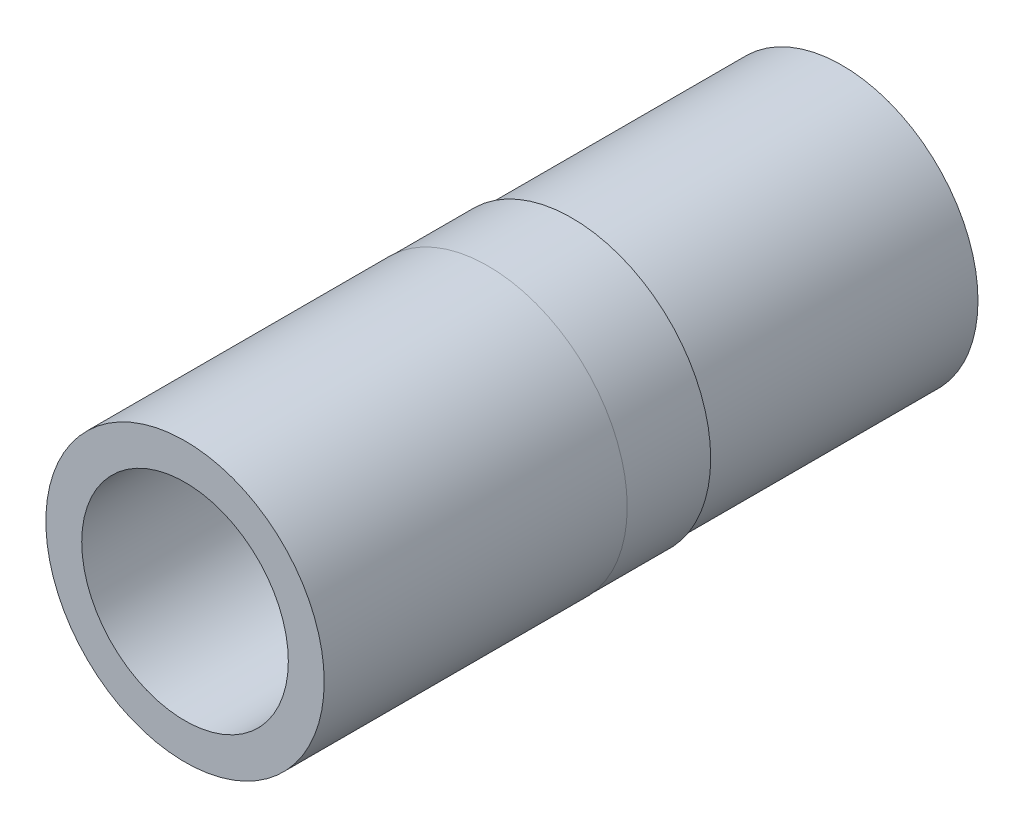
ISO-10303-21;
HEADER;
FILE_DESCRIPTION(('STEP AP214'),'2;1');
FILE_NAME('part.step','',(''),(''),'','','');
FILE_SCHEMA(('AUTOMOTIVE_DESIGN { 1 0 10303 214 1 1 1 1 }'));
ENDSEC;
DATA;
#1=APPLICATION_CONTEXT('core data for automotive mechanical design processes');
#2=APPLICATION_PROTOCOL_DEFINITION('international standard','automotive_design',2000,#1);
#3=PRODUCT_CONTEXT('',#1,'mechanical');
#4=PRODUCT('Part','Part','',(#3));
#5=PRODUCT_RELATED_PRODUCT_CATEGORY('part','',(#4));
#6=PRODUCT_DEFINITION_FORMATION('','',#4);
#7=PRODUCT_DEFINITION_CONTEXT('part definition',#1,'design');
#8=PRODUCT_DEFINITION('design','',#6,#7);
#9=PRODUCT_DEFINITION_SHAPE('','',#8);
#10=(LENGTH_UNIT() NAMED_UNIT(*) SI_UNIT(.MILLI.,.METRE.));
#11=(NAMED_UNIT(*) PLANE_ANGLE_UNIT() SI_UNIT($,.RADIAN.));
#12=(NAMED_UNIT(*) SI_UNIT($,.STERADIAN.) SOLID_ANGLE_UNIT());
#13=UNCERTAINTY_MEASURE_WITH_UNIT(LENGTH_MEASURE(1.E-05),#10,'distance_accuracy_value','');
#14=(GEOMETRIC_REPRESENTATION_CONTEXT(3) GLOBAL_UNCERTAINTY_ASSIGNED_CONTEXT((#13)) GLOBAL_UNIT_ASSIGNED_CONTEXT((#10,
#11,#12)) REPRESENTATION_CONTEXT('',''));
#15=CARTESIAN_POINT('',(0.,0.,0.));
#16=DIRECTION('',(0.,0.,1.));
#17=DIRECTION('',(1.,0.,0.));
#18=AXIS2_PLACEMENT_3D('',#15,#16,#17);
#19=CARTESIAN_POINT('',(0.,0.,67.2));
#20=DIRECTION('',(0.,0.,-1.));
#21=DIRECTION('',(-1.,0.,0.));
#22=AXIS2_PLACEMENT_3D('',#19,#20,#21);
#23=CYLINDRICAL_SURFACE('',#22,25.795);
#24=CARTESIAN_POINT('',(0.,0.,0.));
#25=DIRECTION('',(0.,0.,1.));
#26=DIRECTION('',(1.,0.,0.));
#27=AXIS2_PLACEMENT_3D('',#24,#25,#26);
#28=CIRCLE('',#27,25.795);
#29=CARTESIAN_POINT('',(25.795,0.,0.));
#30=VERTEX_POINT('',#29);
#31=EDGE_CURVE('E50',#30,#30,#28,.T.);
#32=ORIENTED_EDGE('',*,*,#31,.T.);
#33=EDGE_LOOP('',(#32));
#34=FACE_BOUND('',#33,.T.);
#35=CARTESIAN_POINT('',(0.,0.,51.3));
#36=DIRECTION('',(0.,0.,1.));
#37=DIRECTION('',(1.,0.,0.));
#38=AXIS2_PLACEMENT_3D('',#35,#36,#37);
#39=CIRCLE('',#38,25.795);
#40=CARTESIAN_POINT('',(25.795,0.,51.3));
#41=VERTEX_POINT('',#40);
#42=EDGE_CURVE('E10',#41,#41,#39,.T.);
#43=ORIENTED_EDGE('',*,*,#42,.F.);
#44=EDGE_LOOP('',(#43));
#45=FACE_BOUND('',#44,.T.);
#46=ADVANCED_FACE('F39',(#34,#45),#23,.T.);
#47=CARTESIAN_POINT('',(0.,0.,67.2));
#48=DIRECTION('',(0.,0.,-1.));
#49=DIRECTION('',(-1.,0.,0.));
#50=AXIS2_PLACEMENT_3D('',#47,#48,#49);
#51=CYLINDRICAL_SURFACE('',#50,21.195);
#52=CARTESIAN_POINT('',(0.,0.,10.73));
#53=DIRECTION('',(0.,0.,-1.));
#54=DIRECTION('',(-1.,0.,0.));
#55=AXIS2_PLACEMENT_3D('',#52,#53,#54);
#56=CIRCLE('',#55,21.195);
#57=CARTESIAN_POINT('',(-21.195,0.,10.73));
#58=VERTEX_POINT('',#57);
#59=EDGE_CURVE('E55',#58,#58,#56,.T.);
#60=ORIENTED_EDGE('',*,*,#59,.T.);
#61=EDGE_LOOP('',(#60));
#62=FACE_BOUND('',#61,.T.);
#63=CARTESIAN_POINT('',(0.,0.,51.3));
#64=DIRECTION('',(0.,0.,1.));
#65=DIRECTION('',(1.,0.,0.));
#66=AXIS2_PLACEMENT_3D('',#63,#64,#65);
#67=CIRCLE('',#66,21.195);
#68=CARTESIAN_POINT('',(21.195,0.,51.3));
#69=VERTEX_POINT('',#68);
#70=EDGE_CURVE('E42',#69,#69,#67,.F.);
#71=ORIENTED_EDGE('',*,*,#70,.F.);
#72=EDGE_LOOP('',(#71));
#73=FACE_BOUND('',#72,.T.);
#74=ADVANCED_FACE('F72',(#62,#73),#51,.F.);
#75=CARTESIAN_POINT('',(0.,0.,0.));
#76=DIRECTION('',(0.,0.,1.));
#77=DIRECTION('',(1.,0.,0.));
#78=AXIS2_PLACEMENT_3D('',#75,#76,#77);
#79=PLANE('',#78);
#80=CARTESIAN_POINT('',(0.,0.,0.));
#81=DIRECTION('',(0.,0.,-1.));
#82=DIRECTION('',(-1.,0.,0.));
#83=AXIS2_PLACEMENT_3D('',#80,#81,#82);
#84=CIRCLE('',#83,21.795);
#85=CARTESIAN_POINT('',(-21.795,0.,0.));
#86=VERTEX_POINT('',#85);
#87=EDGE_CURVE('E58',#86,#86,#84,.T.);
#88=ORIENTED_EDGE('',*,*,#87,.F.);
#89=EDGE_LOOP('',(#88));
#90=FACE_BOUND('',#89,.T.);
#91=ORIENTED_EDGE('',*,*,#31,.F.);
#92=EDGE_LOOP('',(#91));
#93=FACE_BOUND('',#92,.T.);
#94=ADVANCED_FACE('F69',(#90,#93),#79,.F.);
#95=CARTESIAN_POINT('',(0.,0.,10.73));
#96=DIRECTION('',(0.,0.,-1.));
#97=DIRECTION('',(-1.,0.,0.));
#98=AXIS2_PLACEMENT_3D('',#95,#96,#97);
#99=CYLINDRICAL_SURFACE('',#98,21.795);
#100=CARTESIAN_POINT('',(0.,0.,10.73));
#101=DIRECTION('',(0.,0.,-1.));
#102=DIRECTION('',(-1.,0.,0.));
#103=AXIS2_PLACEMENT_3D('',#100,#101,#102);
#104=CIRCLE('',#103,21.795);
#105=CARTESIAN_POINT('',(-21.795,0.,10.73));
#106=VERTEX_POINT('',#105);
#107=EDGE_CURVE('E60',#106,#106,#104,.T.);
#108=ORIENTED_EDGE('',*,*,#107,.F.);
#109=EDGE_LOOP('',(#108));
#110=FACE_BOUND('',#109,.T.);
#111=ORIENTED_EDGE('',*,*,#87,.T.);
#112=EDGE_LOOP('',(#111));
#113=FACE_BOUND('',#112,.T.);
#114=ADVANCED_FACE('F71',(#110,#113),#99,.F.);
#115=CARTESIAN_POINT('',(0.,0.,10.73));
#116=DIRECTION('',(0.,0.,-1.));
#117=DIRECTION('',(-1.,0.,0.));
#118=AXIS2_PLACEMENT_3D('',#115,#116,#117);
#119=PLANE('',#118);
#120=ORIENTED_EDGE('',*,*,#59,.F.);
#121=EDGE_LOOP('',(#120));
#122=FACE_BOUND('',#121,.T.);
#123=ORIENTED_EDGE('',*,*,#107,.T.);
#124=EDGE_LOOP('',(#123));
#125=FACE_BOUND('',#124,.T.);
#126=ADVANCED_FACE('F77',(#122,#125),#119,.T.);
#127=CARTESIAN_POINT('',(0.,0.,51.3));
#128=DIRECTION('',(0.,0.,1.));
#129=DIRECTION('',(1.,0.,0.));
#130=AXIS2_PLACEMENT_3D('',#127,#128,#129);
#131=PLANE('',#130);
#132=CARTESIAN_POINT('',(0.,0.,51.3));
#133=DIRECTION('',(0.,0.,1.));
#134=DIRECTION('',(1.,0.,0.));
#135=AXIS2_PLACEMENT_3D('',#132,#133,#134);
#136=CIRCLE('',#135,19.6076585618597);
#137=CARTESIAN_POINT('',(19.6076585618597,0.,51.3));
#138=VERTEX_POINT('',#137);
#139=EDGE_CURVE('E181',#138,#138,#136,.T.);
#140=ORIENTED_EDGE('',*,*,#139,.T.);
#141=EDGE_LOOP('',(#140));
#142=FACE_BOUND('',#141,.T.);
#143=ORIENTED_EDGE('',*,*,#70,.T.);
#144=EDGE_LOOP('',(#143));
#145=FACE_BOUND('',#144,.T.);
#146=ADVANCED_FACE('F104',(#142,#145),#131,.F.);
#147=CARTESIAN_POINT('',(0.,0.,51.3));
#148=DIRECTION('',(0.,0.,1.));
#149=DIRECTION('',(1.,0.,0.));
#150=AXIS2_PLACEMENT_3D('',#147,#148,#149);
#151=CIRCLE('',#150,26.36);
#152=CARTESIAN_POINT('',(26.36,0.,51.3));
#153=VERTEX_POINT('',#152);
#154=EDGE_CURVE('E59',#153,#153,#151,.T.);
#155=ORIENTED_EDGE('',*,*,#154,.F.);
#156=EDGE_LOOP('',(#155));
#157=FACE_BOUND('',#156,.T.);
#158=ORIENTED_EDGE('',*,*,#42,.T.);
#159=EDGE_LOOP('',(#158));
#160=FACE_BOUND('',#159,.T.);
#161=ADVANCED_FACE('F99',(#157,#160),#131,.F.);
#162=CARTESIAN_POINT('',(0.,0.,51.3));
#163=DIRECTION('',(0.,0.,1.));
#164=DIRECTION('',(1.,0.,0.));
#165=AXIS2_PLACEMENT_3D('',#162,#163,#164);
#166=CYLINDRICAL_SURFACE('',#165,26.36);
#167=ORIENTED_EDGE('',*,*,#154,.T.);
#168=EDGE_LOOP('',(#167));
#169=FACE_BOUND('',#168,.T.);
#170=CARTESIAN_POINT('',(0.,0.,67.2));
#171=DIRECTION('',(0.,0.,1.));
#172=DIRECTION('',(1.,0.,0.));
#173=AXIS2_PLACEMENT_3D('',#170,#171,#172);
#174=CIRCLE('',#173,26.36);
#175=CARTESIAN_POINT('',(26.36,0.,67.2));
#176=VERTEX_POINT('',#175);
#177=EDGE_CURVE('E53',#176,#176,#174,.T.);
#178=ORIENTED_EDGE('',*,*,#177,.F.);
#179=EDGE_LOOP('',(#178));
#180=FACE_BOUND('',#179,.T.);
#181=ADVANCED_FACE('F103',(#169,#180),#166,.T.);
#182=CARTESIAN_POINT('',(0.,0.,124.71));
#183=DIRECTION('',(0.,0.,-1.));
#184=DIRECTION('',(-1.,0.,0.));
#185=AXIS2_PLACEMENT_3D('',#182,#183,#184);
#186=CYLINDRICAL_SURFACE('',#185,26.415);
#187=CARTESIAN_POINT('',(0.,0.,124.71));
#188=DIRECTION('',(0.,0.,1.));
#189=DIRECTION('',(1.,0.,0.));
#190=AXIS2_PLACEMENT_3D('',#187,#188,#189);
#191=CIRCLE('',#190,26.415);
#192=CARTESIAN_POINT('',(26.415,0.,124.71));
#193=VERTEX_POINT('',#192);
#194=EDGE_CURVE('E185',#193,#193,#191,.T.);
#195=ORIENTED_EDGE('',*,*,#194,.F.);
#196=EDGE_LOOP('',(#195));
#197=FACE_BOUND('',#196,.T.);
#198=CARTESIAN_POINT('',(0.,0.,67.2));
#199=DIRECTION('',(0.,0.,1.));
#200=DIRECTION('',(1.,0.,0.));
#201=AXIS2_PLACEMENT_3D('',#198,#199,#200);
#202=CIRCLE('',#201,26.415);
#203=CARTESIAN_POINT('',(26.415,0.,67.2));
#204=VERTEX_POINT('',#203);
#205=EDGE_CURVE('E182',#204,#204,#202,.T.);
#206=ORIENTED_EDGE('',*,*,#205,.T.);
#207=EDGE_LOOP('',(#206));
#208=FACE_BOUND('',#207,.T.);
#209=ADVANCED_FACE('F114',(#197,#208),#186,.T.);
#210=CARTESIAN_POINT('',(0.,0.,124.71));
#211=DIRECTION('',(0.,0.,1.));
#212=DIRECTION('',(1.,0.,0.));
#213=AXIS2_PLACEMENT_3D('',#210,#211,#212);
#214=PLANE('',#213);
#215=CARTESIAN_POINT('',(0.,0.,124.71));
#216=DIRECTION('',(0.,0.,-1.));
#217=DIRECTION('',(-1.,0.,0.));
#218=AXIS2_PLACEMENT_3D('',#215,#216,#217);
#219=CIRCLE('',#218,19.6076585618597);
#220=CARTESIAN_POINT('',(-19.6076585618597,0.,124.71));
#221=VERTEX_POINT('',#220);
#222=EDGE_CURVE('E178',#221,#221,#219,.T.);
#223=ORIENTED_EDGE('',*,*,#222,.T.);
#224=EDGE_LOOP('',(#223));
#225=FACE_BOUND('',#224,.T.);
#226=ORIENTED_EDGE('',*,*,#194,.T.);
#227=EDGE_LOOP('',(#226));
#228=FACE_BOUND('',#227,.T.);
#229=ADVANCED_FACE('F123',(#225,#228),#214,.T.);
#230=CARTESIAN_POINT('',(0.,0.,67.2));
#231=DIRECTION('',(0.,0.,1.));
#232=DIRECTION('',(1.,0.,0.));
#233=AXIS2_PLACEMENT_3D('',#230,#231,#232);
#234=PLANE('',#233);
#235=ORIENTED_EDGE('',*,*,#177,.T.);
#236=EDGE_LOOP('',(#235));
#237=FACE_BOUND('',#236,.T.);
#238=ORIENTED_EDGE('',*,*,#205,.F.);
#239=EDGE_LOOP('',(#238));
#240=FACE_BOUND('',#239,.T.);
#241=ADVANCED_FACE('F130',(#237,#240),#234,.F.);
#242=CARTESIAN_POINT('',(0.,0.,124.71));
#243=DIRECTION('',(0.,0.,-1.));
#244=DIRECTION('',(-1.,0.,0.));
#245=AXIS2_PLACEMENT_3D('',#242,#243,#244);
#246=CYLINDRICAL_SURFACE('',#245,19.6076585618597);
#247=ORIENTED_EDGE('',*,*,#222,.F.);
#248=EDGE_LOOP('',(#247));
#249=FACE_BOUND('',#248,.T.);
#250=ORIENTED_EDGE('',*,*,#139,.F.);
#251=EDGE_LOOP('',(#250));
#252=FACE_BOUND('',#251,.T.);
#253=ADVANCED_FACE('F134',(#249,#252),#246,.F.);
#254=CLOSED_SHELL('',(#46,#74,#94,#114,#126,#146,#161,#181,#209,#229,#241,#253));
#255=MANIFOLD_SOLID_BREP('B2',#254);
#256=ADVANCED_BREP_SHAPE_REPRESENTATION('',(#18,#255),#14);
#257=SHAPE_DEFINITION_REPRESENTATION(#9,#256);
ENDSEC;
END-ISO-10303-21;
